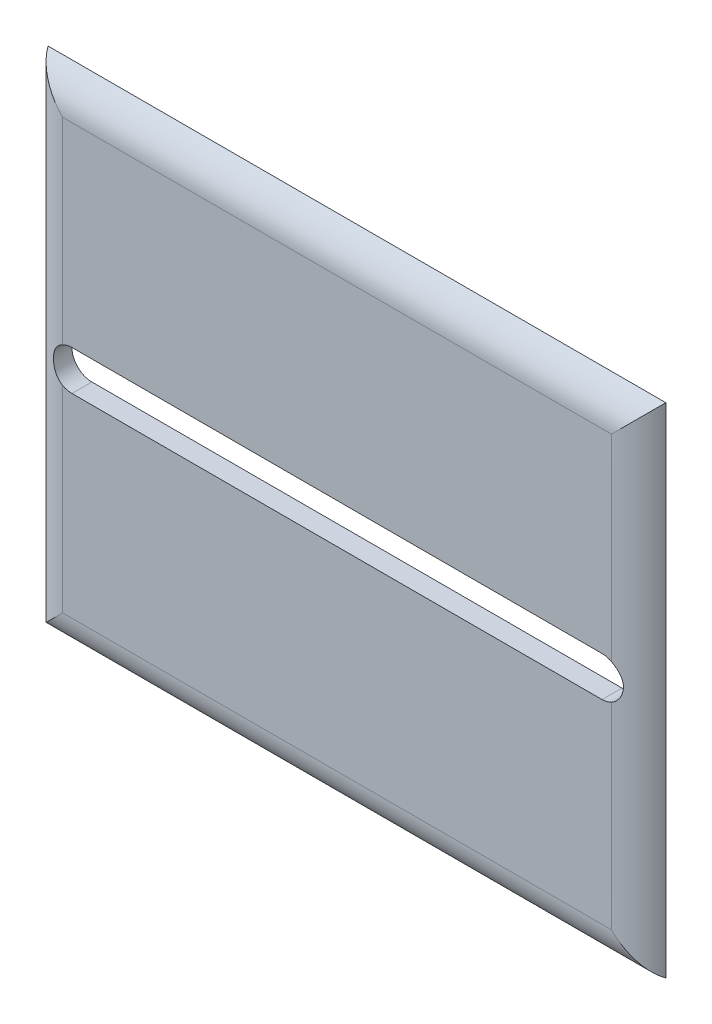
ISO-10303-21;
HEADER;
FILE_DESCRIPTION(('STEP AP214'),'2;1');
FILE_NAME('part.step','',(''),(''),'','','');
FILE_SCHEMA(('AUTOMOTIVE_DESIGN { 1 0 10303 214 1 1 1 1 }'));
ENDSEC;
DATA;
#1=APPLICATION_CONTEXT('core data for automotive mechanical design processes');
#2=APPLICATION_PROTOCOL_DEFINITION('international standard','automotive_design',2000,#1);
#3=PRODUCT_CONTEXT('',#1,'mechanical');
#4=PRODUCT('Part','Part','',(#3));
#5=PRODUCT_RELATED_PRODUCT_CATEGORY('part','',(#4));
#6=PRODUCT_DEFINITION_FORMATION('','',#4);
#7=PRODUCT_DEFINITION_CONTEXT('part definition',#1,'design');
#8=PRODUCT_DEFINITION('design','',#6,#7);
#9=PRODUCT_DEFINITION_SHAPE('','',#8);
#10=(LENGTH_UNIT() NAMED_UNIT(*) SI_UNIT(.MILLI.,.METRE.));
#11=(NAMED_UNIT(*) PLANE_ANGLE_UNIT() SI_UNIT($,.RADIAN.));
#12=(NAMED_UNIT(*) SI_UNIT($,.STERADIAN.) SOLID_ANGLE_UNIT());
#13=UNCERTAINTY_MEASURE_WITH_UNIT(LENGTH_MEASURE(1.E-05),#10,'distance_accuracy_value','');
#14=(GEOMETRIC_REPRESENTATION_CONTEXT(3) GLOBAL_UNCERTAINTY_ASSIGNED_CONTEXT((#13)) GLOBAL_UNIT_ASSIGNED_CONTEXT((#10,
#11,#12)) REPRESENTATION_CONTEXT('',''));
#15=CARTESIAN_POINT('',(0.,0.,0.));
#16=DIRECTION('',(0.,0.,1.));
#17=DIRECTION('',(1.,0.,0.));
#18=AXIS2_PLACEMENT_3D('',#15,#16,#17);
#19=CARTESIAN_POINT('',(0.,0.,5.));
#20=DIRECTION('',(0.,0.,-1.));
#21=DIRECTION('',(-1.,0.,0.));
#22=AXIS2_PLACEMENT_3D('',#19,#20,#21);
#23=PLANE('',#22);
#24=CARTESIAN_POINT('',(11.,62.5,5.));
#25=DIRECTION('',(0.,0.,1.));
#26=DIRECTION('',(1.,0.,0.));
#27=AXIS2_PLACEMENT_3D('',#24,#25,#26);
#28=CIRCLE('',#27,5.);
#29=CARTESIAN_POINT('',(8.66025403784438,58.0812231519824,5.));
#30=VERTEX_POINT('',#29);
#31=CARTESIAN_POINT('',(11.,57.5,5.));
#32=VERTEX_POINT('',#31);
#33=EDGE_CURVE('E112',#30,#32,#28,.T.);
#34=ORIENTED_EDGE('',*,*,#33,.F.);
#35=DIRECTION('',(0.,1.,0.));
#36=VECTOR('',#35,1.);
#37=CARTESIAN_POINT('',(8.66025403784439,0.,5.));
#38=LINE('',#37,#36);
#39=CARTESIAN_POINT('',(8.66025403784439,8.66025403784439,5.));
#40=VERTEX_POINT('',#39);
#41=EDGE_CURVE('E53',#30,#40,#38,.F.);
#42=ORIENTED_EDGE('',*,*,#41,.T.);
#43=DIRECTION('',(-1.,0.,0.));
#44=VECTOR('',#43,1.);
#45=CARTESIAN_POINT('',(0.,8.66025403784439,5.));
#46=LINE('',#45,#44);
#47=CARTESIAN_POINT('',(146.339745962156,8.66025403784439,5.));
#48=VERTEX_POINT('',#47);
#49=EDGE_CURVE('E57',#40,#48,#46,.F.);
#50=ORIENTED_EDGE('',*,*,#49,.T.);
#51=DIRECTION('',(0.,-1.,0.));
#52=VECTOR('',#51,1.);
#53=CARTESIAN_POINT('',(146.339745962156,0.,5.));
#54=LINE('',#53,#52);
#55=CARTESIAN_POINT('',(146.339745962156,58.0812231519824,5.));
#56=VERTEX_POINT('',#55);
#57=EDGE_CURVE('E172',#48,#56,#54,.F.);
#58=ORIENTED_EDGE('',*,*,#57,.T.);
#59=CARTESIAN_POINT('',(144.,62.5,5.));
#60=DIRECTION('',(0.,0.,1.));
#61=DIRECTION('',(1.,0.,0.));
#62=AXIS2_PLACEMENT_3D('',#59,#60,#61);
#63=CIRCLE('',#62,4.99999999999998);
#64=CARTESIAN_POINT('',(144.,57.5,5.));
#65=VERTEX_POINT('',#64);
#66=EDGE_CURVE('E133',#65,#56,#63,.T.);
#67=ORIENTED_EDGE('',*,*,#66,.F.);
#68=DIRECTION('',(1.,0.,0.));
#69=VECTOR('',#68,1.);
#70=CARTESIAN_POINT('',(11.,57.5,5.));
#71=LINE('',#70,#69);
#72=EDGE_CURVE('E124',#32,#65,#71,.T.);
#73=ORIENTED_EDGE('',*,*,#72,.F.);
#74=EDGE_LOOP('',(#34,#42,#50,#58,#67,#73));
#75=FACE_BOUND('',#74,.T.);
#76=ADVANCED_FACE('F35',(#75),#23,.F.);
#77=DIRECTION('',(1.,0.,0.));
#78=VECTOR('',#77,1.);
#79=CARTESIAN_POINT('',(0.,116.339745962156,5.));
#80=LINE('',#79,#78);
#81=CARTESIAN_POINT('',(146.339745962156,116.339745962156,5.));
#82=VERTEX_POINT('',#81);
#83=CARTESIAN_POINT('',(8.66025403784437,116.339745962156,5.));
#84=VERTEX_POINT('',#83);
#85=EDGE_CURVE('E165',#82,#84,#80,.F.);
#86=ORIENTED_EDGE('',*,*,#85,.T.);
#87=DIRECTION('',(0.,1.,0.));
#88=VECTOR('',#87,1.);
#89=CARTESIAN_POINT('',(8.66025403784439,0.,5.));
#90=LINE('',#89,#88);
#91=CARTESIAN_POINT('',(8.66025403784438,66.9187768480176,5.));
#92=VERTEX_POINT('',#91);
#93=EDGE_CURVE('E169',#84,#92,#90,.F.);
#94=ORIENTED_EDGE('',*,*,#93,.T.);
#95=CARTESIAN_POINT('',(11.,67.5,5.));
#96=VERTEX_POINT('',#95);
#97=EDGE_CURVE('E119',#96,#92,#28,.T.);
#98=ORIENTED_EDGE('',*,*,#97,.F.);
#99=DIRECTION('',(-1.,0.,0.));
#100=VECTOR('',#99,1.);
#101=CARTESIAN_POINT('',(11.,67.5,5.));
#102=LINE('',#101,#100);
#103=CARTESIAN_POINT('',(144.,67.5,5.));
#104=VERTEX_POINT('',#103);
#105=EDGE_CURVE('E138',#104,#96,#102,.T.);
#106=ORIENTED_EDGE('',*,*,#105,.F.);
#107=CARTESIAN_POINT('',(146.339745962156,66.9187768480176,5.));
#108=VERTEX_POINT('',#107);
#109=EDGE_CURVE('E134',#108,#104,#63,.T.);
#110=ORIENTED_EDGE('',*,*,#109,.F.);
#111=DIRECTION('',(0.,-1.,0.));
#112=VECTOR('',#111,1.);
#113=CARTESIAN_POINT('',(146.339745962156,0.,5.));
#114=LINE('',#113,#112);
#115=EDGE_CURVE('E167',#108,#82,#114,.F.);
#116=ORIENTED_EDGE('',*,*,#115,.T.);
#117=EDGE_LOOP('',(#86,#94,#98,#106,#110,#116));
#118=FACE_BOUND('',#117,.T.);
#119=ADVANCED_FACE('F209',(#118),#23,.F.);
#120=CARTESIAN_POINT('',(0.,0.,0.));
#121=DIRECTION('',(0.,0.,-1.));
#122=DIRECTION('',(-1.,0.,0.));
#123=AXIS2_PLACEMENT_3D('',#120,#121,#122);
#124=PLANE('',#123);
#125=DIRECTION('',(0.,-1.,0.));
#126=VECTOR('',#125,1.);
#127=CARTESIAN_POINT('',(0.,0.,0.));
#128=LINE('',#127,#126);
#129=CARTESIAN_POINT('',(0.,125.,0.));
#130=VERTEX_POINT('',#129);
#131=CARTESIAN_POINT('',(0.,0.,0.));
#132=VERTEX_POINT('',#131);
#133=EDGE_CURVE('E128',#130,#132,#128,.T.);
#134=ORIENTED_EDGE('',*,*,#133,.F.);
#135=DIRECTION('',(-1.,0.,0.));
#136=VECTOR('',#135,1.);
#137=CARTESIAN_POINT('',(0.,125.,0.));
#138=LINE('',#137,#136);
#139=CARTESIAN_POINT('',(155.,125.,0.));
#140=VERTEX_POINT('',#139);
#141=EDGE_CURVE('E162',#140,#130,#138,.T.);
#142=ORIENTED_EDGE('',*,*,#141,.F.);
#143=DIRECTION('',(0.,1.,0.));
#144=VECTOR('',#143,1.);
#145=CARTESIAN_POINT('',(155.,0.,0.));
#146=LINE('',#145,#144);
#147=CARTESIAN_POINT('',(155.,0.,0.));
#148=VERTEX_POINT('',#147);
#149=EDGE_CURVE('E159',#148,#140,#146,.T.);
#150=ORIENTED_EDGE('',*,*,#149,.F.);
#151=DIRECTION('',(1.,0.,0.));
#152=VECTOR('',#151,1.);
#153=CARTESIAN_POINT('',(0.,0.,0.));
#154=LINE('',#153,#152);
#155=EDGE_CURVE('E156',#132,#148,#154,.T.);
#156=ORIENTED_EDGE('',*,*,#155,.F.);
#157=EDGE_LOOP('',(#134,#142,#150,#156));
#158=FACE_BOUND('',#157,.T.);
#159=DIRECTION('',(-1.,0.,0.));
#160=VECTOR('',#159,1.);
#161=CARTESIAN_POINT('',(11.,67.5,0.));
#162=LINE('',#161,#160);
#163=CARTESIAN_POINT('',(144.,67.5,0.));
#164=VERTEX_POINT('',#163);
#165=CARTESIAN_POINT('',(11.,67.5,0.));
#166=VERTEX_POINT('',#165);
#167=EDGE_CURVE('E120',#164,#166,#162,.T.);
#168=ORIENTED_EDGE('',*,*,#167,.T.);
#169=CARTESIAN_POINT('',(11.,62.5,0.));
#170=DIRECTION('',(0.,0.,1.));
#171=DIRECTION('',(1.,0.,0.));
#172=AXIS2_PLACEMENT_3D('',#169,#170,#171);
#173=CIRCLE('',#172,5.);
#174=CARTESIAN_POINT('',(11.,57.5,0.));
#175=VERTEX_POINT('',#174);
#176=EDGE_CURVE('E141',#166,#175,#173,.T.);
#177=ORIENTED_EDGE('',*,*,#176,.T.);
#178=DIRECTION('',(1.,0.,0.));
#179=VECTOR('',#178,1.);
#180=CARTESIAN_POINT('',(11.,57.5,0.));
#181=LINE('',#180,#179);
#182=CARTESIAN_POINT('',(144.,57.5,0.));
#183=VERTEX_POINT('',#182);
#184=EDGE_CURVE('E127',#175,#183,#181,.T.);
#185=ORIENTED_EDGE('',*,*,#184,.T.);
#186=CARTESIAN_POINT('',(144.,62.5,0.));
#187=DIRECTION('',(0.,0.,1.));
#188=DIRECTION('',(1.,0.,0.));
#189=AXIS2_PLACEMENT_3D('',#186,#187,#188);
#190=CIRCLE('',#189,4.99999999999998);
#191=EDGE_CURVE('E144',#183,#164,#190,.T.);
#192=ORIENTED_EDGE('',*,*,#191,.T.);
#193=EDGE_LOOP('',(#168,#177,#185,#192));
#194=FACE_BOUND('',#193,.T.);
#195=ADVANCED_FACE('F196',(#158,#194),#124,.T.);
#196=CARTESIAN_POINT('',(11.,62.5,5.));
#197=DIRECTION('',(0.,0.,-1.));
#198=DIRECTION('',(-1.,0.,0.));
#199=AXIS2_PLACEMENT_3D('',#196,#197,#198);
#200=CYLINDRICAL_SURFACE('',#199,5.);
#201=ORIENTED_EDGE('',*,*,#97,.T.);
#202=CARTESIAN_POINT('',(8.66025403784438,66.9187768480176,5.));
#203=CARTESIAN_POINT('',(8.53781492053372,66.8539646602705,5.00001258869987));
#204=CARTESIAN_POINT('',(8.41811207162849,66.78404808018,4.99775155922234));
#205=CARTESIAN_POINT('',(8.18505436983454,66.6346327893901,4.98937982702908));
#206=CARTESIAN_POINT('',(8.07169679910784,66.5551382278887,4.98327078646382));
#207=CARTESIAN_POINT('',(7.85232660860095,66.387311552016,4.96791540740275));
#208=CARTESIAN_POINT('',(7.74629918680111,66.298998183625,4.95867562779701));
#209=CARTESIAN_POINT('',(7.54203873952896,66.1140708308313,4.93781362251912));
#210=CARTESIAN_POINT('',(7.44380642820062,66.0174560875884,4.92619117890948));
#211=CARTESIAN_POINT('',(7.16196867985727,65.7163480629654,4.88893266948831));
#212=CARTESIAN_POINT('',(6.9907909260935,65.5002597871266,4.86086962149745));
#213=CARTESIAN_POINT('',(6.68621775265617,65.0430078027022,4.80445296032503));
#214=CARTESIAN_POINT('',(6.55283784440029,64.801833854841,4.77609923278639));
#215=CARTESIAN_POINT('',(6.32416643606181,64.2934074707277,4.72403634282262));
#216=CARTESIAN_POINT('',(6.23002107932612,64.0256208727884,4.70047605394322));
#217=CARTESIAN_POINT('',(6.0882858960011,63.477341411093,4.66387222060911));
#218=CARTESIAN_POINT('',(6.04068228013762,63.1968523365812,4.65082556140317));
#219=CARTESIAN_POINT('',(5.99427984134799,62.6386537816563,4.63810919854744));
#220=CARTESIAN_POINT('',(5.99428737094006,62.3610509129743,4.63811232617084));
#221=CARTESIAN_POINT('',(6.04013245725766,61.8099666739822,4.65067382128939));
#222=CARTESIAN_POINT('',(6.08596725611169,61.5364850566617,4.66323143325938));
#223=CARTESIAN_POINT('',(6.2207179825579,61.0059415482313,4.69811108735029));
#224=CARTESIAN_POINT('',(6.30890999339133,60.7486830876284,4.72026846069799));
#225=CARTESIAN_POINT('',(6.52561523612655,60.2520579594147,4.77013835503304));
#226=CARTESIAN_POINT('',(6.65414979772636,60.0127008395946,4.79785381185529));
#227=CARTESIAN_POINT('',(6.87698885566138,59.6679641385266,4.84001611006209));
#228=CARTESIAN_POINT('',(6.95787050100519,59.553680658135,4.85441044434931));
#229=CARTESIAN_POINT('',(7.12896789758472,59.3322475815365,4.8824429122371));
#230=CARTESIAN_POINT('',(7.21918025823969,59.2250954170625,4.89608131777824));
#231=CARTESIAN_POINT('',(7.40828219688057,59.0187451594467,4.92177692434063));
#232=CARTESIAN_POINT('',(7.50716298763194,58.9195392020813,4.9338356964023));
#233=CARTESIAN_POINT('',(7.71300462341915,58.7296871801502,4.95557278981812));
#234=CARTESIAN_POINT('',(7.81996231838084,58.6390378091488,4.96525203300875));
#235=CARTESIAN_POINT('',(8.04501106291048,58.464034340321,4.98171342300489));
#236=CARTESIAN_POINT('',(8.16335592813204,58.3799956350609,4.98838686142204));
#237=CARTESIAN_POINT('',(8.40688997994613,58.2225184075148,4.99753584779401));
#238=CARTESIAN_POINT('',(8.532072647804,58.1490700241249,5.0000153243215));
#239=CARTESIAN_POINT('',(8.66025403784437,58.0812231519824,5.));
#240=B_SPLINE_CURVE_WITH_KNOTS('',3,(#202,#203,#204,#205,#206,#207,#208,#209,#210,#211,#212,
#213,#214,#215,#216,#217,#218,#219,#220,#221,#222,#223,#224,#225,#226,#227,#228,#229,#230,#231,
#232,#233,#234,#235,#236,#237,#238,#239),.UNSPECIFIED.,.F.,.F.,(4,2,2,2,2,2,2,2,2,2,2,2,2,2,2,2,
2,2,4),(0.,0.415420966634146,0.830662614895653,1.24503965720928,1.65945461868315,
2.48666930117305,3.31422296468471,4.16449506190943,5.01451516616947,5.84322470919604,
6.67188438372936,7.48686003155457,8.30226729686638,8.72410250461856,9.14578496152655,
9.56704479315695,9.98814116940451,10.4234384133079,10.8583276788189),.UNSPECIFIED.);
#241=EDGE_CURVE('E45',#92,#30,#240,.T.);
#242=ORIENTED_EDGE('',*,*,#241,.T.);
#243=ORIENTED_EDGE('',*,*,#33,.T.);
#244=DIRECTION('',(0.,0.,-1.));
#245=VECTOR('',#244,1.);
#246=CARTESIAN_POINT('',(11.,57.5,5.));
#247=LINE('',#246,#245);
#248=EDGE_CURVE('E116',#32,#175,#247,.T.);
#249=ORIENTED_EDGE('',*,*,#248,.T.);
#250=ORIENTED_EDGE('',*,*,#176,.F.);
#251=DIRECTION('',(0.,0.,-1.));
#252=VECTOR('',#251,1.);
#253=CARTESIAN_POINT('',(11.,67.5,5.));
#254=LINE('',#253,#252);
#255=EDGE_CURVE('E140',#96,#166,#254,.T.);
#256=ORIENTED_EDGE('',*,*,#255,.F.);
#257=EDGE_LOOP('',(#201,#242,#243,#249,#250,#256));
#258=FACE_BOUND('',#257,.T.);
#259=ADVANCED_FACE('F115',(#258),#200,.F.);
#260=CARTESIAN_POINT('',(11.,57.5,5.));
#261=DIRECTION('',(0.,1.,0.));
#262=DIRECTION('',(-1.,0.,0.));
#263=AXIS2_PLACEMENT_3D('',#260,#261,#262);
#264=PLANE('',#263);
#265=ORIENTED_EDGE('',*,*,#184,.F.);
#266=ORIENTED_EDGE('',*,*,#248,.F.);
#267=ORIENTED_EDGE('',*,*,#72,.T.);
#268=DIRECTION('',(0.,0.,-1.));
#269=VECTOR('',#268,1.);
#270=CARTESIAN_POINT('',(144.,57.5,5.));
#271=LINE('',#270,#269);
#272=EDGE_CURVE('E129',#65,#183,#271,.T.);
#273=ORIENTED_EDGE('',*,*,#272,.T.);
#274=EDGE_LOOP('',(#265,#266,#267,#273));
#275=FACE_BOUND('',#274,.T.);
#276=ADVANCED_FACE('F123',(#275),#264,.T.);
#277=CARTESIAN_POINT('',(144.,62.5,5.));
#278=DIRECTION('',(0.,0.,-1.));
#279=DIRECTION('',(-1.,0.,0.));
#280=AXIS2_PLACEMENT_3D('',#277,#278,#279);
#281=CYLINDRICAL_SURFACE('',#280,4.99999999999998);
#282=ORIENTED_EDGE('',*,*,#66,.T.);
#283=CARTESIAN_POINT('',(146.339745962156,58.0812231519824,5.));
#284=CARTESIAN_POINT('',(146.462185079466,58.1460353397296,5.00001258869987));
#285=CARTESIAN_POINT('',(146.581887928371,58.2159519198201,4.99775155922234));
#286=CARTESIAN_POINT('',(146.814945630165,58.36536721061,4.98937982702908));
#287=CARTESIAN_POINT('',(146.928303200892,58.4448617721113,4.98327078646382));
#288=CARTESIAN_POINT('',(147.147673391399,58.612688447984,4.96791540740275));
#289=CARTESIAN_POINT('',(147.253700813199,58.701001816375,4.95867562779702));
#290=CARTESIAN_POINT('',(147.457961260471,58.8859291691687,4.93781362251912));
#291=CARTESIAN_POINT('',(147.556193571799,58.9825439124116,4.92619117890948));
#292=CARTESIAN_POINT('',(147.838031320143,59.2836519370347,4.88893266948831));
#293=CARTESIAN_POINT('',(148.009209073906,59.4997402128734,4.86086962149745));
#294=CARTESIAN_POINT('',(148.313782247344,59.9569921972978,4.80445296032503));
#295=CARTESIAN_POINT('',(148.4471621556,60.198166145159,4.77609923278639));
#296=CARTESIAN_POINT('',(148.675833563938,60.7065925292723,4.72403634282262));
#297=CARTESIAN_POINT('',(148.769978920674,60.9743791272116,4.70047605394322));
#298=CARTESIAN_POINT('',(148.911714103999,61.522658588907,4.66387222060911));
#299=CARTESIAN_POINT('',(148.959317719862,61.8031476634188,4.65082556140317));
#300=CARTESIAN_POINT('',(149.005720158652,62.3613462183437,4.63810919854745));
#301=CARTESIAN_POINT('',(149.00571262906,62.6389490870257,4.63811232617085));
#302=CARTESIAN_POINT('',(148.959867542742,63.1900333260178,4.65067382128939));
#303=CARTESIAN_POINT('',(148.914032743888,63.4635149433383,4.66323143325938));
#304=CARTESIAN_POINT('',(148.779282017442,63.9940584517687,4.69811108735028));
#305=CARTESIAN_POINT('',(148.691090006609,64.2513169123716,4.72026846069799));
#306=CARTESIAN_POINT('',(148.474384763873,64.7479420405853,4.77013835503304));
#307=CARTESIAN_POINT('',(148.345850202274,64.9872991604054,4.7978538118553));
#308=CARTESIAN_POINT('',(148.123011144339,65.3320358614734,4.84001611006209));
#309=CARTESIAN_POINT('',(148.042129498995,65.446319341865,4.85441044434931));
#310=CARTESIAN_POINT('',(147.871032102415,65.6677524184634,4.8824429122371));
#311=CARTESIAN_POINT('',(147.78081974176,65.7749045829374,4.89608131777824));
#312=CARTESIAN_POINT('',(147.591717803119,65.9812548405532,4.92177692434063));
#313=CARTESIAN_POINT('',(147.492837012368,66.0804607979187,4.93383569640229));
#314=CARTESIAN_POINT('',(147.286995376581,66.2703128198497,4.95557278981812));
#315=CARTESIAN_POINT('',(147.180037681619,66.3609621908512,4.96525203300875));
#316=CARTESIAN_POINT('',(146.954988937089,66.535965659679,4.9817134230049));
#317=CARTESIAN_POINT('',(146.836644071868,66.6200043649391,4.98838686142204));
#318=CARTESIAN_POINT('',(146.593110020054,66.7774815924851,4.99753584779401));
#319=CARTESIAN_POINT('',(146.467927352196,66.8509299758751,5.0000153243215));
#320=CARTESIAN_POINT('',(146.339745962156,66.9187768480176,5.));
#321=B_SPLINE_CURVE_WITH_KNOTS('',3,(#283,#284,#285,#286,#287,#288,#289,#290,#291,#292,#293,
#294,#295,#296,#297,#298,#299,#300,#301,#302,#303,#304,#305,#306,#307,#308,#309,#310,#311,#312,
#313,#314,#315,#316,#317,#318,#319,#320),.UNSPECIFIED.,.F.,.F.,(4,2,2,2,2,2,2,2,2,2,2,2,2,2,2,2,
2,2,4),(0.,0.415420966634139,0.830662614895656,1.24503965720927,1.65945461868314,
2.48666930117302,3.3142229646847,4.1644950619094,5.01451516616943,5.843224709196,
6.67188438372931,7.48686003155452,8.30226729686632,8.72410250461849,9.1457849615265,
9.5670447931569,9.98814116940446,10.4234384133079,10.8583276788189),.UNSPECIFIED.);
#322=EDGE_CURVE('E11',#56,#108,#321,.T.);
#323=ORIENTED_EDGE('',*,*,#322,.T.);
#324=ORIENTED_EDGE('',*,*,#109,.T.);
#325=DIRECTION('',(0.,0.,-1.));
#326=VECTOR('',#325,1.);
#327=CARTESIAN_POINT('',(144.,67.5,5.));
#328=LINE('',#327,#326);
#329=EDGE_CURVE('E151',#104,#164,#328,.T.);
#330=ORIENTED_EDGE('',*,*,#329,.T.);
#331=ORIENTED_EDGE('',*,*,#191,.F.);
#332=ORIENTED_EDGE('',*,*,#272,.F.);
#333=EDGE_LOOP('',(#282,#323,#324,#330,#331,#332));
#334=FACE_BOUND('',#333,.T.);
#335=ADVANCED_FACE('F243',(#334),#281,.F.);
#336=CARTESIAN_POINT('',(11.,67.5,5.));
#337=DIRECTION('',(0.,-1.,0.));
#338=DIRECTION('',(1.,0.,0.));
#339=AXIS2_PLACEMENT_3D('',#336,#337,#338);
#340=PLANE('',#339);
#341=ORIENTED_EDGE('',*,*,#167,.F.);
#342=ORIENTED_EDGE('',*,*,#329,.F.);
#343=ORIENTED_EDGE('',*,*,#105,.T.);
#344=ORIENTED_EDGE('',*,*,#255,.T.);
#345=EDGE_LOOP('',(#341,#342,#343,#344));
#346=FACE_BOUND('',#345,.T.);
#347=ADVANCED_FACE('F205',(#346),#340,.T.);
#348=CARTESIAN_POINT('',(146.339745962156,0.,-5.));
#349=DIRECTION('',(0.,-1.,0.));
#350=DIRECTION('',(1.,0.,0.));
#351=AXIS2_PLACEMENT_3D('',#348,#349,#350);
#352=CYLINDRICAL_SURFACE('',#351,10.);
#353=CARTESIAN_POINT('',(146.339745962156,8.66025403784439,-5.));
#354=DIRECTION('',(-0.707106781186547,-0.707106781186548,0.));
#355=DIRECTION('',(0.707106781186548,-0.707106781186547,0.));
#356=AXIS2_PLACEMENT_3D('',#353,#354,#355);
#357=ELLIPSE('',#356,14.142135623731,10.);
#358=EDGE_CURVE('E227',#148,#48,#357,.T.);
#359=ORIENTED_EDGE('',*,*,#358,.F.);
#360=ORIENTED_EDGE('',*,*,#149,.T.);
#361=CARTESIAN_POINT('',(146.339745962156,116.339745962156,-5.));
#362=DIRECTION('',(0.707106781186548,-0.707106781186547,0.));
#363=DIRECTION('',(0.707106781186547,0.707106781186548,0.));
#364=AXIS2_PLACEMENT_3D('',#361,#362,#363);
#365=ELLIPSE('',#364,14.142135623731,10.);
#366=EDGE_CURVE('E40',#82,#140,#365,.F.);
#367=ORIENTED_EDGE('',*,*,#366,.F.);
#368=ORIENTED_EDGE('',*,*,#115,.F.);
#369=ORIENTED_EDGE('',*,*,#322,.F.);
#370=ORIENTED_EDGE('',*,*,#57,.F.);
#371=EDGE_LOOP('',(#359,#360,#367,#368,#369,#370));
#372=FACE_BOUND('',#371,.T.);
#373=ADVANCED_FACE('F37',(#372),#352,.T.);
#374=CARTESIAN_POINT('',(0.,116.339745962156,-5.));
#375=DIRECTION('',(1.,0.,0.));
#376=DIRECTION('',(0.,1.,0.));
#377=AXIS2_PLACEMENT_3D('',#374,#375,#376);
#378=CYLINDRICAL_SURFACE('',#377,10.);
#379=ORIENTED_EDGE('',*,*,#366,.T.);
#380=ORIENTED_EDGE('',*,*,#141,.T.);
#381=CARTESIAN_POINT('',(8.66025403784437,116.339745962156,-5.));
#382=DIRECTION('',(0.707106781186547,0.707106781186548,0.));
#383=DIRECTION('',(0.707106781186548,-0.707106781186547,0.));
#384=AXIS2_PLACEMENT_3D('',#381,#382,#383);
#385=ELLIPSE('',#384,14.1421356237309,10.);
#386=EDGE_CURVE('E225',#84,#130,#385,.F.);
#387=ORIENTED_EDGE('',*,*,#386,.F.);
#388=ORIENTED_EDGE('',*,*,#85,.F.);
#389=EDGE_LOOP('',(#379,#380,#387,#388));
#390=FACE_BOUND('',#389,.T.);
#391=ADVANCED_FACE('F198',(#390),#378,.T.);
#392=CARTESIAN_POINT('',(0.,8.66025403784439,-5.));
#393=DIRECTION('',(-1.,0.,0.));
#394=DIRECTION('',(0.,0.,1.));
#395=AXIS2_PLACEMENT_3D('',#392,#393,#394);
#396=CYLINDRICAL_SURFACE('',#395,10.);
#397=ORIENTED_EDGE('',*,*,#358,.T.);
#398=ORIENTED_EDGE('',*,*,#49,.F.);
#399=CARTESIAN_POINT('',(8.66025403784439,8.66025403784439,-5.));
#400=DIRECTION('',(-0.707106781186548,0.707106781186547,0.));
#401=DIRECTION('',(-0.707106781186547,-0.707106781186548,0.));
#402=AXIS2_PLACEMENT_3D('',#399,#400,#401);
#403=ELLIPSE('',#402,14.1421356237309,10.);
#404=EDGE_CURVE('E228',#132,#40,#403,.T.);
#405=ORIENTED_EDGE('',*,*,#404,.F.);
#406=ORIENTED_EDGE('',*,*,#155,.T.);
#407=EDGE_LOOP('',(#397,#398,#405,#406));
#408=FACE_BOUND('',#407,.T.);
#409=ADVANCED_FACE('F194',(#408),#396,.T.);
#410=CARTESIAN_POINT('',(8.66025403784439,0.,-5.));
#411=DIRECTION('',(0.,1.,0.));
#412=DIRECTION('',(-1.,0.,0.));
#413=AXIS2_PLACEMENT_3D('',#410,#411,#412);
#414=CYLINDRICAL_SURFACE('',#413,10.);
#415=ORIENTED_EDGE('',*,*,#386,.T.);
#416=ORIENTED_EDGE('',*,*,#133,.T.);
#417=ORIENTED_EDGE('',*,*,#404,.T.);
#418=ORIENTED_EDGE('',*,*,#41,.F.);
#419=ORIENTED_EDGE('',*,*,#241,.F.);
#420=ORIENTED_EDGE('',*,*,#93,.F.);
#421=EDGE_LOOP('',(#415,#416,#417,#418,#419,#420));
#422=FACE_BOUND('',#421,.T.);
#423=ADVANCED_FACE('F189',(#422),#414,.T.);
#424=CLOSED_SHELL('',(#76,#119,#195,#259,#276,#335,#347,#373,#391,#409,#423));
#425=MANIFOLD_SOLID_BREP('B2',#424);
#426=ADVANCED_BREP_SHAPE_REPRESENTATION('',(#18,#425),#14);
#427=SHAPE_DEFINITION_REPRESENTATION(#9,#426);
ENDSEC;
END-ISO-10303-21;
